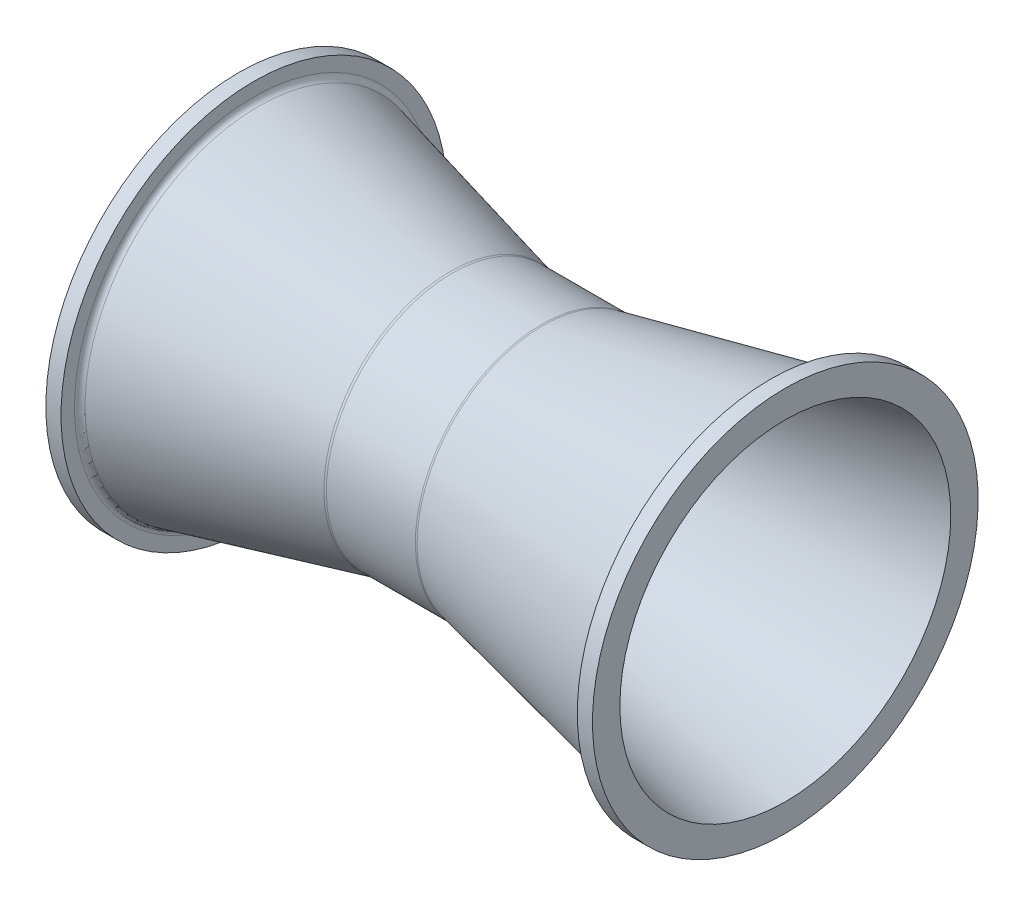
ISO-10303-21;
HEADER;
FILE_DESCRIPTION(('STEP AP214'),'2;1');
FILE_NAME('part.step','',(''),(''),'','','');
FILE_SCHEMA(('AUTOMOTIVE_DESIGN { 1 0 10303 214 1 1 1 1 }'));
ENDSEC;
DATA;
#1=APPLICATION_CONTEXT('core data for automotive mechanical design processes');
#2=APPLICATION_PROTOCOL_DEFINITION('international standard','automotive_design',2000,#1);
#3=PRODUCT_CONTEXT('',#1,'mechanical');
#4=PRODUCT('Part','Part','',(#3));
#5=PRODUCT_RELATED_PRODUCT_CATEGORY('part','',(#4));
#6=PRODUCT_DEFINITION_FORMATION('','',#4);
#7=PRODUCT_DEFINITION_CONTEXT('part definition',#1,'design');
#8=PRODUCT_DEFINITION('design','',#6,#7);
#9=PRODUCT_DEFINITION_SHAPE('','',#8);
#10=(LENGTH_UNIT() NAMED_UNIT(*) SI_UNIT(.MILLI.,.METRE.));
#11=(NAMED_UNIT(*) PLANE_ANGLE_UNIT() SI_UNIT($,.RADIAN.));
#12=(NAMED_UNIT(*) SI_UNIT($,.STERADIAN.) SOLID_ANGLE_UNIT());
#13=UNCERTAINTY_MEASURE_WITH_UNIT(LENGTH_MEASURE(1.E-05),#10,'distance_accuracy_value','');
#14=(GEOMETRIC_REPRESENTATION_CONTEXT(3) GLOBAL_UNCERTAINTY_ASSIGNED_CONTEXT((#13)) GLOBAL_UNIT_ASSIGNED_CONTEXT((#10,
#11,#12)) REPRESENTATION_CONTEXT('',''));
#15=CARTESIAN_POINT('',(0.,0.,0.));
#16=DIRECTION('',(0.,0.,1.));
#17=DIRECTION('',(1.,0.,0.));
#18=AXIS2_PLACEMENT_3D('',#15,#16,#17);
#19=CARTESIAN_POINT('',(6.,0.,0.));
#20=DIRECTION('',(1.,0.,0.));
#21=DIRECTION('',(0.,0.,-1.));
#22=AXIS2_PLACEMENT_3D('',#19,#20,#21);
#23=PLANE('',#22);
#24=CARTESIAN_POINT('',(6.,25.1147367097489,14.4999999999998));
#25=DIRECTION('',(1.,0.,0.));
#26=DIRECTION('',(0.,0.,-1.));
#27=AXIS2_PLACEMENT_3D('',#24,#25,#26);
#28=CIRCLE('',#27,4.);
#29=CARTESIAN_POINT('',(6.,25.1147367097489,10.4999999999998));
#30=VERTEX_POINT('',#29);
#31=EDGE_CURVE('E84',#30,#30,#28,.T.);
#32=ORIENTED_EDGE('',*,*,#31,.F.);
#33=EDGE_LOOP('',(#32));
#34=FACE_BOUND('',#33,.T.);
#35=CARTESIAN_POINT('',(6.,0.,-29.));
#36=DIRECTION('',(1.,0.,0.));
#37=DIRECTION('',(0.,0.,-1.));
#38=AXIS2_PLACEMENT_3D('',#35,#36,#37);
#39=CIRCLE('',#38,4.);
#40=CARTESIAN_POINT('',(6.,0.,-33.));
#41=VERTEX_POINT('',#40);
#42=EDGE_CURVE('E74',#41,#41,#39,.T.);
#43=ORIENTED_EDGE('',*,*,#42,.F.);
#44=EDGE_LOOP('',(#43));
#45=FACE_BOUND('',#44,.T.);
#46=CARTESIAN_POINT('',(6.,0.,0.));
#47=DIRECTION('',(1.,0.,0.));
#48=DIRECTION('',(0.,0.,-1.));
#49=AXIS2_PLACEMENT_3D('',#46,#47,#48);
#50=CIRCLE('',#49,37.5);
#51=CARTESIAN_POINT('',(6.,0.,-37.5));
#52=VERTEX_POINT('',#51);
#53=EDGE_CURVE('E96',#52,#52,#50,.F.);
#54=ORIENTED_EDGE('',*,*,#53,.F.);
#55=EDGE_LOOP('',(#54));
#56=FACE_BOUND('',#55,.T.);
#57=CARTESIAN_POINT('',(6.,-25.1147367097486,14.5000000000001));
#58=DIRECTION('',(1.,0.,0.));
#59=DIRECTION('',(0.,0.,-1.));
#60=AXIS2_PLACEMENT_3D('',#57,#58,#59);
#61=CIRCLE('',#60,4.00000000000001);
#62=CARTESIAN_POINT('',(6.,-25.1147367097486,10.5000000000001));
#63=VERTEX_POINT('',#62);
#64=EDGE_CURVE('E78',#63,#63,#61,.T.);
#65=ORIENTED_EDGE('',*,*,#64,.F.);
#66=EDGE_LOOP('',(#65));
#67=FACE_BOUND('',#66,.T.);
#68=CARTESIAN_POINT('',(6.,0.,0.));
#69=DIRECTION('',(1.,0.,0.));
#70=DIRECTION('',(0.,0.,-1.));
#71=AXIS2_PLACEMENT_3D('',#68,#69,#70);
#72=CIRCLE('',#71,15.);
#73=CARTESIAN_POINT('',(6.,0.,-15.));
#74=VERTEX_POINT('',#73);
#75=EDGE_CURVE('E90',#74,#74,#72,.T.);
#76=ORIENTED_EDGE('',*,*,#75,.F.);
#77=EDGE_LOOP('',(#76));
#78=FACE_BOUND('',#77,.T.);
#79=ADVANCED_FACE('F39',(#34,#45,#56,#67,#78),#23,.T.);
#80=CARTESIAN_POINT('',(0.,0.,0.));
#81=DIRECTION('',(1.,0.,0.));
#82=DIRECTION('',(0.,0.,-1.));
#83=AXIS2_PLACEMENT_3D('',#80,#81,#82);
#84=PLANE('',#83);
#85=CARTESIAN_POINT('',(0.,0.,0.));
#86=DIRECTION('',(1.,0.,0.));
#87=DIRECTION('',(0.,0.,-1.));
#88=AXIS2_PLACEMENT_3D('',#85,#86,#87);
#89=CIRCLE('',#88,37.5);
#90=CARTESIAN_POINT('',(0.,0.,-37.5));
#91=VERTEX_POINT('',#90);
#92=EDGE_CURVE('E71',#91,#91,#89,.T.);
#93=ORIENTED_EDGE('',*,*,#92,.F.);
#94=EDGE_LOOP('',(#93));
#95=FACE_BOUND('',#94,.T.);
#96=CARTESIAN_POINT('',(0.,0.,-29.));
#97=DIRECTION('',(1.,0.,0.));
#98=DIRECTION('',(0.,0.,-1.));
#99=AXIS2_PLACEMENT_3D('',#96,#97,#98);
#100=CIRCLE('',#99,4.);
#101=CARTESIAN_POINT('',(0.,0.,-33.));
#102=VERTEX_POINT('',#101);
#103=EDGE_CURVE('E75',#102,#102,#100,.T.);
#104=ORIENTED_EDGE('',*,*,#103,.T.);
#105=EDGE_LOOP('',(#104));
#106=FACE_BOUND('',#105,.T.);
#107=CARTESIAN_POINT('',(0.,-25.1147367097486,14.5000000000001));
#108=DIRECTION('',(1.,0.,0.));
#109=DIRECTION('',(0.,0.,-1.));
#110=AXIS2_PLACEMENT_3D('',#107,#108,#109);
#111=CIRCLE('',#110,4.00000000000001);
#112=CARTESIAN_POINT('',(0.,-25.1147367097486,10.5000000000001));
#113=VERTEX_POINT('',#112);
#114=EDGE_CURVE('E81',#113,#113,#111,.T.);
#115=ORIENTED_EDGE('',*,*,#114,.T.);
#116=EDGE_LOOP('',(#115));
#117=FACE_BOUND('',#116,.T.);
#118=CARTESIAN_POINT('',(0.,25.1147367097489,14.4999999999998));
#119=DIRECTION('',(1.,0.,0.));
#120=DIRECTION('',(0.,0.,-1.));
#121=AXIS2_PLACEMENT_3D('',#118,#119,#120);
#122=CIRCLE('',#121,4.);
#123=CARTESIAN_POINT('',(0.,25.1147367097489,10.4999999999998));
#124=VERTEX_POINT('',#123);
#125=EDGE_CURVE('E87',#124,#124,#122,.T.);
#126=ORIENTED_EDGE('',*,*,#125,.T.);
#127=EDGE_LOOP('',(#126));
#128=FACE_BOUND('',#127,.T.);
#129=CARTESIAN_POINT('',(0.,0.,0.));
#130=DIRECTION('',(1.,0.,0.));
#131=DIRECTION('',(0.,0.,-1.));
#132=AXIS2_PLACEMENT_3D('',#129,#130,#131);
#133=CIRCLE('',#132,15.);
#134=CARTESIAN_POINT('',(0.,0.,-15.));
#135=VERTEX_POINT('',#134);
#136=EDGE_CURVE('E93',#135,#135,#133,.T.);
#137=ORIENTED_EDGE('',*,*,#136,.T.);
#138=EDGE_LOOP('',(#137));
#139=FACE_BOUND('',#138,.T.);
#140=ADVANCED_FACE('F146',(#95,#106,#117,#128,#139),#84,.F.);
#141=CARTESIAN_POINT('',(6.,0.,-29.));
#142=DIRECTION('',(-1.,0.,0.));
#143=DIRECTION('',(0.,0.,1.));
#144=AXIS2_PLACEMENT_3D('',#141,#142,#143);
#145=CYLINDRICAL_SURFACE('',#144,4.);
#146=ORIENTED_EDGE('',*,*,#42,.T.);
#147=EDGE_LOOP('',(#146));
#148=FACE_BOUND('',#147,.T.);
#149=ORIENTED_EDGE('',*,*,#103,.F.);
#150=EDGE_LOOP('',(#149));
#151=FACE_BOUND('',#150,.T.);
#152=ADVANCED_FACE('F152',(#148,#151),#145,.F.);
#153=CARTESIAN_POINT('',(6.,-25.1147367097486,14.5000000000001));
#154=DIRECTION('',(-1.,0.,0.));
#155=DIRECTION('',(0.,0.,1.));
#156=AXIS2_PLACEMENT_3D('',#153,#154,#155);
#157=CYLINDRICAL_SURFACE('',#156,4.00000000000001);
#158=ORIENTED_EDGE('',*,*,#64,.T.);
#159=EDGE_LOOP('',(#158));
#160=FACE_BOUND('',#159,.T.);
#161=ORIENTED_EDGE('',*,*,#114,.F.);
#162=EDGE_LOOP('',(#161));
#163=FACE_BOUND('',#162,.T.);
#164=ADVANCED_FACE('F312',(#160,#163),#157,.F.);
#165=CARTESIAN_POINT('',(6.,25.1147367097489,14.4999999999998));
#166=DIRECTION('',(-1.,0.,0.));
#167=DIRECTION('',(0.,0.,1.));
#168=AXIS2_PLACEMENT_3D('',#165,#166,#167);
#169=CYLINDRICAL_SURFACE('',#168,4.);
#170=ORIENTED_EDGE('',*,*,#31,.T.);
#171=EDGE_LOOP('',(#170));
#172=FACE_BOUND('',#171,.T.);
#173=ORIENTED_EDGE('',*,*,#125,.F.);
#174=EDGE_LOOP('',(#173));
#175=FACE_BOUND('',#174,.T.);
#176=ADVANCED_FACE('F303',(#172,#175),#169,.F.);
#177=CARTESIAN_POINT('',(6.,0.,0.));
#178=DIRECTION('',(-1.,0.,0.));
#179=DIRECTION('',(0.,0.,1.));
#180=AXIS2_PLACEMENT_3D('',#177,#178,#179);
#181=CYLINDRICAL_SURFACE('',#180,15.);
#182=ORIENTED_EDGE('',*,*,#75,.T.);
#183=EDGE_LOOP('',(#182));
#184=FACE_BOUND('',#183,.T.);
#185=ORIENTED_EDGE('',*,*,#136,.F.);
#186=EDGE_LOOP('',(#185));
#187=FACE_BOUND('',#186,.T.);
#188=ADVANCED_FACE('F130',(#184,#187),#181,.F.);
#189=CARTESIAN_POINT('',(110.,5.07535849736441E-13,0.));
#190=DIRECTION('',(-1.,0.,0.));
#191=DIRECTION('',(0.,-1.,0.));
#192=AXIS2_PLACEMENT_3D('',#189,#190,#191);
#193=PLANE('',#192);
#194=CARTESIAN_POINT('',(110.,0.,0.));
#195=DIRECTION('',(1.,0.,0.));
#196=DIRECTION('',(0.,1.,0.));
#197=AXIS2_PLACEMENT_3D('',#194,#195,#196);
#198=CIRCLE('',#197,54.4766571583919);
#199=CARTESIAN_POINT('',(110.,54.4766571583919,0.));
#200=VERTEX_POINT('',#199);
#201=EDGE_CURVE('E119',#200,#200,#198,.T.);
#202=ORIENTED_EDGE('',*,*,#201,.F.);
#203=EDGE_LOOP('',(#202));
#204=FACE_BOUND('',#203,.T.);
#205=CARTESIAN_POINT('',(110.,0.,0.));
#206=DIRECTION('',(1.,0.,0.));
#207=DIRECTION('',(0.,1.,0.));
#208=AXIS2_PLACEMENT_3D('',#205,#206,#207);
#209=CIRCLE('',#208,63.5);
#210=CARTESIAN_POINT('',(110.,63.5,0.));
#211=VERTEX_POINT('',#210);
#212=EDGE_CURVE('E101',#211,#211,#209,.T.);
#213=ORIENTED_EDGE('',*,*,#212,.T.);
#214=EDGE_LOOP('',(#213));
#215=FACE_BOUND('',#214,.T.);
#216=ADVANCED_FACE('F126',(#204,#215),#193,.F.);
#217=CARTESIAN_POINT('',(0.,0.,0.));
#218=DIRECTION('',(1.,0.,0.));
#219=DIRECTION('',(0.,1.,0.));
#220=AXIS2_PLACEMENT_3D('',#217,#218,#219);
#221=CYLINDRICAL_SURFACE('',#220,63.5);
#222=CARTESIAN_POINT('',(105.,0.,0.));
#223=DIRECTION('',(1.,0.,0.));
#224=DIRECTION('',(0.,1.,0.));
#225=AXIS2_PLACEMENT_3D('',#222,#223,#224);
#226=CIRCLE('',#225,63.5);
#227=CARTESIAN_POINT('',(105.,63.5,0.));
#228=VERTEX_POINT('',#227);
#229=EDGE_CURVE('E104',#228,#228,#226,.T.);
#230=ORIENTED_EDGE('',*,*,#229,.T.);
#231=EDGE_LOOP('',(#230));
#232=FACE_BOUND('',#231,.T.);
#233=ORIENTED_EDGE('',*,*,#212,.F.);
#234=EDGE_LOOP('',(#233));
#235=FACE_BOUND('',#234,.T.);
#236=ADVANCED_FACE('F129',(#232,#235),#221,.T.);
#237=CARTESIAN_POINT('',(105.,0.,0.));
#238=DIRECTION('',(-1.,0.,0.));
#239=DIRECTION('',(0.,-1.,0.));
#240=AXIS2_PLACEMENT_3D('',#237,#238,#239);
#241=PLANE('',#240);
#242=CARTESIAN_POINT('',(105.,0.,0.));
#243=DIRECTION('',(-1.,0.,0.));
#244=DIRECTION('',(0.,-1.,0.));
#245=AXIS2_PLACEMENT_3D('',#242,#243,#244);
#246=CIRCLE('',#245,59.1183380874707);
#247=CARTESIAN_POINT('',(105.,-59.1183380874707,0.));
#248=VERTEX_POINT('',#247);
#249=EDGE_CURVE('E68',#248,#248,#246,.F.);
#250=ORIENTED_EDGE('',*,*,#249,.T.);
#251=EDGE_LOOP('',(#250));
#252=FACE_BOUND('',#251,.T.);
#253=ORIENTED_EDGE('',*,*,#229,.F.);
#254=EDGE_LOOP('',(#253));
#255=FACE_BOUND('',#254,.T.);
#256=ADVANCED_FACE('F135',(#252,#255),#241,.T.);
#257=CARTESIAN_POINT('',(30.,0.,0.));
#258=DIRECTION('',(1.,0.,0.));
#259=DIRECTION('',(0.,1.,0.));
#260=AXIS2_PLACEMENT_3D('',#257,#258,#259);
#261=CONICAL_SURFACE('',#260,41.5,0.21018258666217);
#262=CARTESIAN_POINT('',(30.3094757377832,0.,0.));
#263=DIRECTION('',(1.,0.,0.));
#264=DIRECTION('',(0.,1.,0.));
#265=AXIS2_PLACEMENT_3D('',#262,#263,#264);
#266=CIRCLE('',#265,41.5660214907271);
#267=CARTESIAN_POINT('',(30.3094757377832,41.5660214907271,0.));
#268=VERTEX_POINT('',#267);
#269=EDGE_CURVE('E54',#268,#268,#266,.T.);
#270=ORIENTED_EDGE('',*,*,#269,.T.);
#271=EDGE_LOOP('',(#270));
#272=FACE_BOUND('',#271,.T.);
#273=CARTESIAN_POINT('',(103.417276943541,0.,0.));
#274=DIRECTION('',(-1.,0.,0.));
#275=DIRECTION('',(0.,-1.,0.));
#276=AXIS2_PLACEMENT_3D('',#273,#274,#275);
#277=CIRCLE('',#276,57.1623524146221);
#278=CARTESIAN_POINT('',(103.417276943541,-57.1623524146221,0.));
#279=VERTEX_POINT('',#278);
#280=EDGE_CURVE('E65',#279,#279,#277,.T.);
#281=ORIENTED_EDGE('',*,*,#280,.T.);
#282=EDGE_LOOP('',(#281));
#283=FACE_BOUND('',#282,.T.);
#284=ADVANCED_FACE('F142',(#272,#283),#261,.T.);
#285=CARTESIAN_POINT('',(0.,0.,0.));
#286=DIRECTION('',(1.,0.,0.));
#287=DIRECTION('',(0.,1.,0.));
#288=AXIS2_PLACEMENT_3D('',#285,#286,#287);
#289=CYLINDRICAL_SURFACE('',#288,41.5);
#290=CARTESIAN_POINT('',(29.6835603224717,0.,0.));
#291=DIRECTION('',(1.,0.,0.));
#292=DIRECTION('',(0.,1.,0.));
#293=AXIS2_PLACEMENT_3D('',#290,#291,#292);
#294=CIRCLE('',#293,41.5);
#295=CARTESIAN_POINT('',(29.6835603224717,41.5,0.));
#296=VERTEX_POINT('',#295);
#297=EDGE_CURVE('E46',#296,#296,#294,.F.);
#298=ORIENTED_EDGE('',*,*,#297,.T.);
#299=EDGE_LOOP('',(#298));
#300=FACE_BOUND('',#299,.T.);
#301=CARTESIAN_POINT('',(0.363800978384669,0.,0.));
#302=DIRECTION('',(1.,0.,0.));
#303=DIRECTION('',(0.,1.,0.));
#304=AXIS2_PLACEMENT_3D('',#301,#302,#303);
#305=CIRCLE('',#304,41.5);
#306=CARTESIAN_POINT('',(0.363800978384664,41.5,0.));
#307=VERTEX_POINT('',#306);
#308=EDGE_CURVE('E50',#307,#307,#305,.T.);
#309=ORIENTED_EDGE('',*,*,#308,.T.);
#310=EDGE_LOOP('',(#309));
#311=FACE_BOUND('',#310,.T.);
#312=ADVANCED_FACE('F180',(#300,#311),#289,.T.);
#313=CARTESIAN_POINT('',(-65.,0.,0.));
#314=DIRECTION('',(-1.,0.,0.));
#315=DIRECTION('',(0.,-1.,0.));
#316=AXIS2_PLACEMENT_3D('',#313,#314,#315);
#317=CONICAL_SURFACE('',#316,57.5,0.241355490575404);
#318=CARTESIAN_POINT('',(-0.353256162982544,0.,0.));
#319=DIRECTION('',(-1.,0.,0.));
#320=DIRECTION('',(0.,-1.,0.));
#321=AXIS2_PLACEMENT_3D('',#318,#319,#320);
#322=CIRCLE('',#321,41.5869553631957);
#323=CARTESIAN_POINT('',(-0.353256162982539,-41.5869553631957,0.));
#324=VERTEX_POINT('',#323);
#325=EDGE_CURVE('E10',#324,#324,#322,.T.);
#326=ORIENTED_EDGE('',*,*,#325,.T.);
#327=EDGE_LOOP('',(#326));
#328=FACE_BOUND('',#327,.T.);
#329=CARTESIAN_POINT('',(-63.4780380942448,0.,0.));
#330=DIRECTION('',(-1.,0.,0.));
#331=DIRECTION('',(0.,-1.,0.));
#332=AXIS2_PLACEMENT_3D('',#329,#330,#331);
#333=CIRCLE('',#332,57.1253632231987);
#334=CARTESIAN_POINT('',(-63.4780380942448,-57.1253632231987,0.));
#335=VERTEX_POINT('',#334);
#336=EDGE_CURVE('E62',#335,#335,#333,.F.);
#337=ORIENTED_EDGE('',*,*,#336,.T.);
#338=EDGE_LOOP('',(#337));
#339=FACE_BOUND('',#338,.T.);
#340=ADVANCED_FACE('F190',(#328,#339),#317,.T.);
#341=CARTESIAN_POINT('',(-65.,0.,0.));
#342=DIRECTION('',(-1.,0.,0.));
#343=DIRECTION('',(0.,-1.,0.));
#344=AXIS2_PLACEMENT_3D('',#341,#342,#343);
#345=PLANE('',#344);
#346=CARTESIAN_POINT('',(-65.,0.,0.));
#347=DIRECTION('',(-1.,0.,0.));
#348=DIRECTION('',(0.,-1.,0.));
#349=AXIS2_PLACEMENT_3D('',#346,#347,#348);
#350=CIRCLE('',#349,59.0673929810683);
#351=CARTESIAN_POINT('',(-65.,-59.0673929810683,0.));
#352=VERTEX_POINT('',#351);
#353=EDGE_CURVE('E59',#352,#352,#350,.T.);
#354=ORIENTED_EDGE('',*,*,#353,.T.);
#355=EDGE_LOOP('',(#354));
#356=FACE_BOUND('',#355,.T.);
#357=CARTESIAN_POINT('',(-65.,0.,0.));
#358=DIRECTION('',(1.,0.,0.));
#359=DIRECTION('',(0.,1.,0.));
#360=AXIS2_PLACEMENT_3D('',#357,#358,#359);
#361=CIRCLE('',#360,63.5);
#362=CARTESIAN_POINT('',(-65.,63.5,0.));
#363=VERTEX_POINT('',#362);
#364=EDGE_CURVE('E107',#363,#363,#361,.T.);
#365=ORIENTED_EDGE('',*,*,#364,.T.);
#366=EDGE_LOOP('',(#365));
#367=FACE_BOUND('',#366,.T.);
#368=ADVANCED_FACE('F194',(#356,#367),#345,.F.);
#369=CARTESIAN_POINT('',(0.,0.,0.));
#370=DIRECTION('',(1.,0.,0.));
#371=DIRECTION('',(0.,1.,0.));
#372=AXIS2_PLACEMENT_3D('',#369,#370,#371);
#373=CYLINDRICAL_SURFACE('',#372,63.5);
#374=ORIENTED_EDGE('',*,*,#364,.F.);
#375=EDGE_LOOP('',(#374));
#376=FACE_BOUND('',#375,.T.);
#377=CARTESIAN_POINT('',(-70.,0.,0.));
#378=DIRECTION('',(1.,0.,0.));
#379=DIRECTION('',(0.,1.,0.));
#380=AXIS2_PLACEMENT_3D('',#377,#378,#379);
#381=CIRCLE('',#380,63.5);
#382=CARTESIAN_POINT('',(-70.,63.5,0.));
#383=VERTEX_POINT('',#382);
#384=EDGE_CURVE('E110',#383,#383,#381,.T.);
#385=ORIENTED_EDGE('',*,*,#384,.T.);
#386=EDGE_LOOP('',(#385));
#387=FACE_BOUND('',#386,.T.);
#388=ADVANCED_FACE('F197',(#376,#387),#373,.T.);
#389=CARTESIAN_POINT('',(-70.,-2.21557665001949E-13,0.));
#390=DIRECTION('',(-1.,0.,0.));
#391=DIRECTION('',(0.,-1.,0.));
#392=AXIS2_PLACEMENT_3D('',#389,#390,#391);
#393=PLANE('',#392);
#394=CARTESIAN_POINT('',(-70.,0.,0.));
#395=DIRECTION('',(1.,0.,0.));
#396=DIRECTION('',(0.,1.,0.));
#397=AXIS2_PLACEMENT_3D('',#394,#395,#396);
#398=CIRCLE('',#397,54.7307692307692);
#399=CARTESIAN_POINT('',(-70.,54.7307692307692,0.));
#400=VERTEX_POINT('',#399);
#401=EDGE_CURVE('E113',#400,#400,#398,.T.);
#402=ORIENTED_EDGE('',*,*,#401,.T.);
#403=EDGE_LOOP('',(#402));
#404=FACE_BOUND('',#403,.T.);
#405=ORIENTED_EDGE('',*,*,#384,.F.);
#406=EDGE_LOOP('',(#405));
#407=FACE_BOUND('',#406,.T.);
#408=ADVANCED_FACE('F200',(#404,#407),#393,.T.);
#409=CARTESIAN_POINT('',(0.,0.,0.));
#410=DIRECTION('',(-1.,0.,0.));
#411=DIRECTION('',(0.,-1.,0.));
#412=AXIS2_PLACEMENT_3D('',#409,#410,#411);
#413=CONICAL_SURFACE('',#412,37.5,0.241355490575403);
#414=ORIENTED_EDGE('',*,*,#401,.F.);
#415=EDGE_LOOP('',(#414));
#416=FACE_BOUND('',#415,.T.);
#417=ORIENTED_EDGE('',*,*,#92,.T.);
#418=EDGE_LOOP('',(#417));
#419=FACE_BOUND('',#418,.T.);
#420=ADVANCED_FACE('F204',(#416,#419),#413,.F.);
#421=CARTESIAN_POINT('',(0.,0.,0.));
#422=DIRECTION('',(1.,0.,0.));
#423=DIRECTION('',(0.,1.,0.));
#424=AXIS2_PLACEMENT_3D('',#421,#422,#423);
#425=CYLINDRICAL_SURFACE('',#424,37.5);
#426=ORIENTED_EDGE('',*,*,#53,.T.);
#427=EDGE_LOOP('',(#426));
#428=FACE_BOUND('',#427,.T.);
#429=CARTESIAN_POINT('',(30.4219195700378,0.,0.));
#430=DIRECTION('',(1.,0.,0.));
#431=DIRECTION('',(0.,1.,0.));
#432=AXIS2_PLACEMENT_3D('',#429,#430,#431);
#433=CIRCLE('',#432,37.5);
#434=CARTESIAN_POINT('',(30.4219195700378,37.5,0.));
#435=VERTEX_POINT('',#434);
#436=EDGE_CURVE('E116',#435,#435,#433,.T.);
#437=ORIENTED_EDGE('',*,*,#436,.T.);
#438=EDGE_LOOP('',(#437));
#439=FACE_BOUND('',#438,.T.);
#440=ADVANCED_FACE('F208',(#428,#439),#425,.F.);
#441=CARTESIAN_POINT('',(30.4219195700378,0.,0.));
#442=DIRECTION('',(1.,0.,0.));
#443=DIRECTION('',(0.,1.,0.));
#444=AXIS2_PLACEMENT_3D('',#441,#442,#443);
#445=CONICAL_SURFACE('',#444,37.5,0.210182586662169);
#446=ORIENTED_EDGE('',*,*,#201,.T.);
#447=EDGE_LOOP('',(#446));
#448=FACE_BOUND('',#447,.T.);
#449=ORIENTED_EDGE('',*,*,#436,.F.);
#450=EDGE_LOOP('',(#449));
#451=FACE_BOUND('',#450,.T.);
#452=ADVANCED_FACE('F123',(#448,#451),#445,.F.);
#453=CARTESIAN_POINT('',(103.,0.,0.));
#454=DIRECTION('',(-1.,0.,0.));
#455=DIRECTION('',(0.,-1.,0.));
#456=AXIS2_PLACEMENT_3D('',#453,#454,#455);
#457=TOROIDAL_SURFACE('',#456,59.1183380874707,2.);
#458=ORIENTED_EDGE('',*,*,#280,.F.);
#459=EDGE_LOOP('',(#458));
#460=FACE_BOUND('',#459,.T.);
#461=ORIENTED_EDGE('',*,*,#249,.F.);
#462=EDGE_LOOP('',(#461));
#463=FACE_BOUND('',#462,.T.);
#464=ADVANCED_FACE('F160',(#460,#463),#457,.F.);
#465=CARTESIAN_POINT('',(-63.,0.,0.));
#466=DIRECTION('',(-1.,0.,0.));
#467=DIRECTION('',(0.,-1.,0.));
#468=AXIS2_PLACEMENT_3D('',#465,#466,#467);
#469=TOROIDAL_SURFACE('',#468,59.0673929810683,2.);
#470=ORIENTED_EDGE('',*,*,#353,.F.);
#471=EDGE_LOOP('',(#470));
#472=FACE_BOUND('',#471,.T.);
#473=ORIENTED_EDGE('',*,*,#336,.F.);
#474=EDGE_LOOP('',(#473));
#475=FACE_BOUND('',#474,.T.);
#476=ADVANCED_FACE('F163',(#472,#475),#469,.F.);
#477=CARTESIAN_POINT('',(29.6835603224717,0.,0.));
#478=DIRECTION('',(1.,0.,0.));
#479=DIRECTION('',(0.,1.,0.));
#480=AXIS2_PLACEMENT_3D('',#477,#478,#479);
#481=TOROIDAL_SURFACE('',#480,44.5,3.);
#482=ORIENTED_EDGE('',*,*,#297,.F.);
#483=EDGE_LOOP('',(#482));
#484=FACE_BOUND('',#483,.T.);
#485=ORIENTED_EDGE('',*,*,#269,.F.);
#486=EDGE_LOOP('',(#485));
#487=FACE_BOUND('',#486,.T.);
#488=ADVANCED_FACE('F166',(#484,#487),#481,.F.);
#489=CARTESIAN_POINT('',(0.363800978384669,0.,0.));
#490=DIRECTION('',(1.,0.,0.));
#491=DIRECTION('',(0.,1.,0.));
#492=AXIS2_PLACEMENT_3D('',#489,#490,#491);
#493=TOROIDAL_SURFACE('',#492,44.5,3.);
#494=ORIENTED_EDGE('',*,*,#325,.F.);
#495=EDGE_LOOP('',(#494));
#496=FACE_BOUND('',#495,.T.);
#497=ORIENTED_EDGE('',*,*,#308,.F.);
#498=EDGE_LOOP('',(#497));
#499=FACE_BOUND('',#498,.T.);
#500=ADVANCED_FACE('F41',(#496,#499),#493,.F.);
#501=CLOSED_SHELL('',(#79,#140,#152,#164,#176,#188,#216,#236,#256,#284,#312,#340,#368,#388,#408,
#420,#440,#452,#464,#476,#488,#500));
#502=MANIFOLD_SOLID_BREP('B2',#501);
#503=ADVANCED_BREP_SHAPE_REPRESENTATION('',(#18,#502),#14);
#504=SHAPE_DEFINITION_REPRESENTATION(#9,#503);
ENDSEC;
END-ISO-10303-21;
